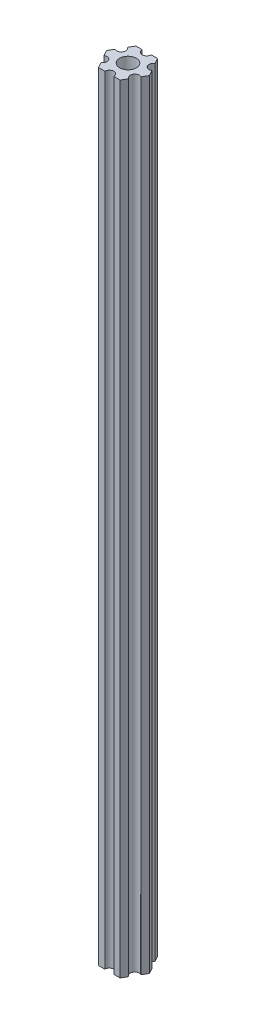
ISO-10303-21;
HEADER;
FILE_DESCRIPTION(('STEP AP214'),'2;1');
FILE_NAME('part.step','',(''),(''),'','','');
FILE_SCHEMA(('AUTOMOTIVE_DESIGN { 1 0 10303 214 1 1 1 1 }'));
ENDSEC;
DATA;
#1=APPLICATION_CONTEXT('core data for automotive mechanical design processes');
#2=APPLICATION_PROTOCOL_DEFINITION('international standard','automotive_design',2000,#1);
#3=PRODUCT_CONTEXT('',#1,'mechanical');
#4=PRODUCT('Part','Part','',(#3));
#5=PRODUCT_RELATED_PRODUCT_CATEGORY('part','',(#4));
#6=PRODUCT_DEFINITION_FORMATION('','',#4);
#7=PRODUCT_DEFINITION_CONTEXT('part definition',#1,'design');
#8=PRODUCT_DEFINITION('design','',#6,#7);
#9=PRODUCT_DEFINITION_SHAPE('','',#8);
#10=(LENGTH_UNIT() NAMED_UNIT(*) SI_UNIT(.MILLI.,.METRE.));
#11=(NAMED_UNIT(*) PLANE_ANGLE_UNIT() SI_UNIT($,.RADIAN.));
#12=(NAMED_UNIT(*) SI_UNIT($,.STERADIAN.) SOLID_ANGLE_UNIT());
#13=UNCERTAINTY_MEASURE_WITH_UNIT(LENGTH_MEASURE(1.E-05),#10,'distance_accuracy_value','');
#14=(GEOMETRIC_REPRESENTATION_CONTEXT(3) GLOBAL_UNCERTAINTY_ASSIGNED_CONTEXT((#13)) GLOBAL_UNIT_ASSIGNED_CONTEXT((#10,
#11,#12)) REPRESENTATION_CONTEXT('',''));
#15=CARTESIAN_POINT('',(0.,0.,0.));
#16=DIRECTION('',(0.,0.,1.));
#17=DIRECTION('',(1.,0.,0.));
#18=AXIS2_PLACEMENT_3D('',#15,#16,#17);
#19=CARTESIAN_POINT('',(5.41265877365274,-175.,3.125));
#20=DIRECTION('',(0.,1.,0.));
#21=DIRECTION('',(0.,0.,1.));
#22=AXIS2_PLACEMENT_3D('',#19,#20,#21);
#23=CYLINDRICAL_SURFACE('',#22,1.5);
#24=CARTESIAN_POINT('',(5.41265877365274,85.,3.125));
#25=DIRECTION('',(0.,-1.,0.));
#26=DIRECTION('',(0.,0.,-1.));
#27=AXIS2_PLACEMENT_3D('',#24,#25,#26);
#28=CIRCLE('',#27,1.5);
#29=CARTESIAN_POINT('',(4.66265877365274,85.,4.42403810567666));
#30=VERTEX_POINT('',#29);
#31=CARTESIAN_POINT('',(6.16265877365274,85.,1.82596189432335));
#32=VERTEX_POINT('',#31);
#33=EDGE_CURVE('E189',#30,#32,#28,.T.);
#34=ORIENTED_EDGE('',*,*,#33,.F.);
#35=DIRECTION('',(0.,1.,0.));
#36=VECTOR('',#35,1.);
#37=CARTESIAN_POINT('',(4.66265877365274,-175.,4.42403810567666));
#38=LINE('',#37,#36);
#39=CARTESIAN_POINT('',(4.66265877365274,-175.,4.42403810567666));
#40=VERTEX_POINT('',#39);
#41=EDGE_CURVE('E11',#40,#30,#38,.T.);
#42=ORIENTED_EDGE('',*,*,#41,.F.);
#43=CARTESIAN_POINT('',(5.41265877365274,-175.,3.125));
#44=DIRECTION('',(0.,-1.,0.));
#45=DIRECTION('',(0.,0.,-1.));
#46=AXIS2_PLACEMENT_3D('',#43,#44,#45);
#47=CIRCLE('',#46,1.5);
#48=CARTESIAN_POINT('',(6.16265877365274,-175.,1.82596189432335));
#49=VERTEX_POINT('',#48);
#50=EDGE_CURVE('E240',#40,#49,#47,.T.);
#51=ORIENTED_EDGE('',*,*,#50,.T.);
#52=DIRECTION('',(0.,1.,0.));
#53=VECTOR('',#52,1.);
#54=CARTESIAN_POINT('',(6.16265877365274,-175.,1.82596189432335));
#55=LINE('',#54,#53);
#56=EDGE_CURVE('E35',#49,#32,#55,.T.);
#57=ORIENTED_EDGE('',*,*,#56,.T.);
#58=EDGE_LOOP('',(#34,#42,#51,#57));
#59=FACE_BOUND('',#58,.T.);
#60=ADVANCED_FACE('F32',(#59),#23,.F.);
#61=CARTESIAN_POINT('',(3.60843918243516,-175.,6.25));
#62=DIRECTION('',(0.866025403784439,0.,0.5));
#63=DIRECTION('',(0.5,0.,-0.866025403784439));
#64=AXIS2_PLACEMENT_3D('',#61,#62,#63);
#65=PLANE('',#64);
#66=DIRECTION('',(0.5,0.,-0.866025403784439));
#67=VECTOR('',#66,1.);
#68=CARTESIAN_POINT('',(3.60843918243516,85.,6.25));
#69=LINE('',#68,#67);
#70=CARTESIAN_POINT('',(3.60843918243516,85.,6.25));
#71=VERTEX_POINT('',#70);
#72=EDGE_CURVE('E238',#71,#30,#69,.T.);
#73=ORIENTED_EDGE('',*,*,#72,.F.);
#74=DIRECTION('',(0.,1.,0.));
#75=VECTOR('',#74,1.);
#76=CARTESIAN_POINT('',(3.60843918243516,-175.,6.25));
#77=LINE('',#76,#75);
#78=CARTESIAN_POINT('',(3.60843918243516,-175.,6.25));
#79=VERTEX_POINT('',#78);
#80=EDGE_CURVE('E41',#79,#71,#77,.T.);
#81=ORIENTED_EDGE('',*,*,#80,.F.);
#82=DIRECTION('',(0.5,0.,-0.866025403784439));
#83=VECTOR('',#82,1.);
#84=CARTESIAN_POINT('',(3.60843918243516,-175.,6.25));
#85=LINE('',#84,#83);
#86=EDGE_CURVE('E179',#79,#40,#85,.T.);
#87=ORIENTED_EDGE('',*,*,#86,.T.);
#88=ORIENTED_EDGE('',*,*,#41,.T.);
#89=EDGE_LOOP('',(#73,#81,#87,#88));
#90=FACE_BOUND('',#89,.T.);
#91=ADVANCED_FACE('F272',(#90),#65,.T.);
#92=CARTESIAN_POINT('',(1.5,-175.,6.25));
#93=DIRECTION('',(0.,0.,1.));
#94=DIRECTION('',(1.,0.,0.));
#95=AXIS2_PLACEMENT_3D('',#92,#93,#94);
#96=PLANE('',#95);
#97=DIRECTION('',(1.,0.,0.));
#98=VECTOR('',#97,1.);
#99=CARTESIAN_POINT('',(1.5,85.,6.25));
#100=LINE('',#99,#98);
#101=CARTESIAN_POINT('',(1.5,85.,6.25));
#102=VERTEX_POINT('',#101);
#103=EDGE_CURVE('E166',#102,#71,#100,.T.);
#104=ORIENTED_EDGE('',*,*,#103,.F.);
#105=DIRECTION('',(0.,1.,0.));
#106=VECTOR('',#105,1.);
#107=CARTESIAN_POINT('',(1.5,-175.,6.25));
#108=LINE('',#107,#106);
#109=CARTESIAN_POINT('',(1.5,-175.,6.25));
#110=VERTEX_POINT('',#109);
#111=EDGE_CURVE('E161',#110,#102,#108,.T.);
#112=ORIENTED_EDGE('',*,*,#111,.F.);
#113=DIRECTION('',(1.,0.,0.));
#114=VECTOR('',#113,1.);
#115=CARTESIAN_POINT('',(1.5,-175.,6.25));
#116=LINE('',#115,#114);
#117=EDGE_CURVE('E164',#110,#79,#116,.T.);
#118=ORIENTED_EDGE('',*,*,#117,.T.);
#119=ORIENTED_EDGE('',*,*,#80,.T.);
#120=EDGE_LOOP('',(#104,#112,#118,#119));
#121=FACE_BOUND('',#120,.T.);
#122=ADVANCED_FACE('F163',(#121),#96,.T.);
#123=CARTESIAN_POINT('',(0.,-175.,6.25));
#124=DIRECTION('',(0.,1.,0.));
#125=DIRECTION('',(0.,0.,1.));
#126=AXIS2_PLACEMENT_3D('',#123,#124,#125);
#127=CYLINDRICAL_SURFACE('',#126,1.5);
#128=CARTESIAN_POINT('',(0.,85.,6.25));
#129=DIRECTION('',(0.,-1.,0.));
#130=DIRECTION('',(0.,0.,-1.));
#131=AXIS2_PLACEMENT_3D('',#128,#129,#130);
#132=CIRCLE('',#131,1.5);
#133=CARTESIAN_POINT('',(-1.5,85.,6.25));
#134=VERTEX_POINT('',#133);
#135=EDGE_CURVE('E235',#134,#102,#132,.T.);
#136=ORIENTED_EDGE('',*,*,#135,.F.);
#137=DIRECTION('',(0.,1.,0.));
#138=VECTOR('',#137,1.);
#139=CARTESIAN_POINT('',(-1.5,-175.,6.25));
#140=LINE('',#139,#138);
#141=CARTESIAN_POINT('',(-1.5,-175.,6.25));
#142=VERTEX_POINT('',#141);
#143=EDGE_CURVE('E171',#142,#134,#140,.T.);
#144=ORIENTED_EDGE('',*,*,#143,.F.);
#145=CARTESIAN_POINT('',(0.,-175.,6.25));
#146=DIRECTION('',(0.,-1.,0.));
#147=DIRECTION('',(0.,0.,-1.));
#148=AXIS2_PLACEMENT_3D('',#145,#146,#147);
#149=CIRCLE('',#148,1.5);
#150=EDGE_CURVE('E177',#142,#110,#149,.T.);
#151=ORIENTED_EDGE('',*,*,#150,.T.);
#152=ORIENTED_EDGE('',*,*,#111,.T.);
#153=EDGE_LOOP('',(#136,#144,#151,#152));
#154=FACE_BOUND('',#153,.T.);
#155=ADVANCED_FACE('F181',(#154),#127,.F.);
#156=CARTESIAN_POINT('',(-3.60843918243516,-175.,6.25));
#157=DIRECTION('',(0.,0.,1.));
#158=DIRECTION('',(1.,0.,0.));
#159=AXIS2_PLACEMENT_3D('',#156,#157,#158);
#160=PLANE('',#159);
#161=DIRECTION('',(1.,0.,0.));
#162=VECTOR('',#161,1.);
#163=CARTESIAN_POINT('',(-3.60843918243516,85.,6.25));
#164=LINE('',#163,#162);
#165=CARTESIAN_POINT('',(-3.60843918243516,85.,6.25));
#166=VERTEX_POINT('',#165);
#167=EDGE_CURVE('E232',#166,#134,#164,.T.);
#168=ORIENTED_EDGE('',*,*,#167,.F.);
#169=DIRECTION('',(0.,1.,0.));
#170=VECTOR('',#169,1.);
#171=CARTESIAN_POINT('',(-3.60843918243516,-175.,6.25));
#172=LINE('',#171,#170);
#173=CARTESIAN_POINT('',(-3.60843918243516,-175.,6.25));
#174=VERTEX_POINT('',#173);
#175=EDGE_CURVE('E244',#174,#166,#172,.T.);
#176=ORIENTED_EDGE('',*,*,#175,.F.);
#177=DIRECTION('',(1.,0.,0.));
#178=VECTOR('',#177,1.);
#179=CARTESIAN_POINT('',(-3.60843918243516,-175.,6.25));
#180=LINE('',#179,#178);
#181=EDGE_CURVE('E182',#174,#142,#180,.T.);
#182=ORIENTED_EDGE('',*,*,#181,.T.);
#183=ORIENTED_EDGE('',*,*,#143,.T.);
#184=EDGE_LOOP('',(#168,#176,#182,#183));
#185=FACE_BOUND('',#184,.T.);
#186=ADVANCED_FACE('F285',(#185),#160,.T.);
#187=CARTESIAN_POINT('',(-4.66265877365274,-175.,4.42403810567666));
#188=DIRECTION('',(-0.866025403784439,0.,0.5));
#189=DIRECTION('',(0.5,0.,0.866025403784439));
#190=AXIS2_PLACEMENT_3D('',#187,#188,#189);
#191=PLANE('',#190);
#192=DIRECTION('',(0.5,0.,0.866025403784439));
#193=VECTOR('',#192,1.);
#194=CARTESIAN_POINT('',(-4.66265877365274,85.,4.42403810567666));
#195=LINE('',#194,#193);
#196=CARTESIAN_POINT('',(-4.66265877365274,85.,4.42403810567666));
#197=VERTEX_POINT('',#196);
#198=EDGE_CURVE('E229',#197,#166,#195,.T.);
#199=ORIENTED_EDGE('',*,*,#198,.F.);
#200=DIRECTION('',(0.,1.,0.));
#201=VECTOR('',#200,1.);
#202=CARTESIAN_POINT('',(-4.66265877365274,-175.,4.42403810567666));
#203=LINE('',#202,#201);
#204=CARTESIAN_POINT('',(-4.66265877365274,-175.,4.42403810567666));
#205=VERTEX_POINT('',#204);
#206=EDGE_CURVE('E246',#205,#197,#203,.T.);
#207=ORIENTED_EDGE('',*,*,#206,.F.);
#208=DIRECTION('',(0.5,0.,0.866025403784439));
#209=VECTOR('',#208,1.);
#210=CARTESIAN_POINT('',(-4.66265877365274,-175.,4.42403810567666));
#211=LINE('',#210,#209);
#212=EDGE_CURVE('E184',#205,#174,#211,.T.);
#213=ORIENTED_EDGE('',*,*,#212,.T.);
#214=ORIENTED_EDGE('',*,*,#175,.T.);
#215=EDGE_LOOP('',(#199,#207,#213,#214));
#216=FACE_BOUND('',#215,.T.);
#217=ADVANCED_FACE('F288',(#216),#191,.T.);
#218=CARTESIAN_POINT('',(-5.41265877365274,-175.,3.125));
#219=DIRECTION('',(0.,1.,0.));
#220=DIRECTION('',(0.,0.,1.));
#221=AXIS2_PLACEMENT_3D('',#218,#219,#220);
#222=CYLINDRICAL_SURFACE('',#221,1.5);
#223=CARTESIAN_POINT('',(-5.41265877365274,85.,3.125));
#224=DIRECTION('',(0.,-1.,0.));
#225=DIRECTION('',(0.,0.,-1.));
#226=AXIS2_PLACEMENT_3D('',#223,#224,#225);
#227=CIRCLE('',#226,1.5);
#228=CARTESIAN_POINT('',(-6.16265877365274,85.,1.82596189432335));
#229=VERTEX_POINT('',#228);
#230=EDGE_CURVE('E226',#229,#197,#227,.T.);
#231=ORIENTED_EDGE('',*,*,#230,.F.);
#232=DIRECTION('',(0.,1.,0.));
#233=VECTOR('',#232,1.);
#234=CARTESIAN_POINT('',(-6.16265877365274,-175.,1.82596189432335));
#235=LINE('',#234,#233);
#236=CARTESIAN_POINT('',(-6.16265877365274,-175.,1.82596189432335));
#237=VERTEX_POINT('',#236);
#238=EDGE_CURVE('E248',#237,#229,#235,.T.);
#239=ORIENTED_EDGE('',*,*,#238,.F.);
#240=CARTESIAN_POINT('',(-5.41265877365274,-175.,3.125));
#241=DIRECTION('',(0.,-1.,0.));
#242=DIRECTION('',(0.,0.,-1.));
#243=AXIS2_PLACEMENT_3D('',#240,#241,#242);
#244=CIRCLE('',#243,1.5);
#245=EDGE_CURVE('E393',#237,#205,#244,.T.);
#246=ORIENTED_EDGE('',*,*,#245,.T.);
#247=ORIENTED_EDGE('',*,*,#206,.T.);
#248=EDGE_LOOP('',(#231,#239,#246,#247));
#249=FACE_BOUND('',#248,.T.);
#250=ADVANCED_FACE('F292',(#249),#222,.F.);
#251=CARTESIAN_POINT('',(-7.21687836487032,-175.,0.));
#252=DIRECTION('',(-0.866025403784439,0.,0.499999999999998));
#253=DIRECTION('',(0.499999999999998,0.,0.86602540378444));
#254=AXIS2_PLACEMENT_3D('',#251,#252,#253);
#255=PLANE('',#254);
#256=DIRECTION('',(0.499999999999998,0.,0.86602540378444));
#257=VECTOR('',#256,1.);
#258=CARTESIAN_POINT('',(-7.21687836487032,85.,0.));
#259=LINE('',#258,#257);
#260=CARTESIAN_POINT('',(-7.21687836487032,85.,0.));
#261=VERTEX_POINT('',#260);
#262=EDGE_CURVE('E223',#261,#229,#259,.T.);
#263=ORIENTED_EDGE('',*,*,#262,.F.);
#264=DIRECTION('',(0.,1.,0.));
#265=VECTOR('',#264,1.);
#266=CARTESIAN_POINT('',(-7.21687836487032,-175.,0.));
#267=LINE('',#266,#265);
#268=CARTESIAN_POINT('',(-7.21687836487032,-175.,0.));
#269=VERTEX_POINT('',#268);
#270=EDGE_CURVE('E250',#269,#261,#267,.T.);
#271=ORIENTED_EDGE('',*,*,#270,.F.);
#272=DIRECTION('',(0.499999999999998,0.,0.86602540378444));
#273=VECTOR('',#272,1.);
#274=CARTESIAN_POINT('',(-7.21687836487032,-175.,0.));
#275=LINE('',#274,#273);
#276=EDGE_CURVE('E390',#269,#237,#275,.T.);
#277=ORIENTED_EDGE('',*,*,#276,.T.);
#278=ORIENTED_EDGE('',*,*,#238,.T.);
#279=EDGE_LOOP('',(#263,#271,#277,#278));
#280=FACE_BOUND('',#279,.T.);
#281=ADVANCED_FACE('F296',(#280),#255,.T.);
#282=CARTESIAN_POINT('',(-6.16265877365274,-175.,-1.82596189432334));
#283=DIRECTION('',(-0.866025403784438,0.,-0.5));
#284=DIRECTION('',(-0.5,0.,0.866025403784438));
#285=AXIS2_PLACEMENT_3D('',#282,#283,#284);
#286=PLANE('',#285);
#287=DIRECTION('',(-0.5,0.,0.866025403784438));
#288=VECTOR('',#287,1.);
#289=CARTESIAN_POINT('',(-6.16265877365274,85.,-1.82596189432334));
#290=LINE('',#289,#288);
#291=CARTESIAN_POINT('',(-6.16265877365274,85.,-1.82596189432334));
#292=VERTEX_POINT('',#291);
#293=EDGE_CURVE('E220',#292,#261,#290,.T.);
#294=ORIENTED_EDGE('',*,*,#293,.F.);
#295=DIRECTION('',(0.,1.,0.));
#296=VECTOR('',#295,1.);
#297=CARTESIAN_POINT('',(-6.16265877365274,-175.,-1.82596189432334));
#298=LINE('',#297,#296);
#299=CARTESIAN_POINT('',(-6.16265877365274,-175.,-1.82596189432334));
#300=VERTEX_POINT('',#299);
#301=EDGE_CURVE('E252',#300,#292,#298,.T.);
#302=ORIENTED_EDGE('',*,*,#301,.F.);
#303=DIRECTION('',(-0.5,0.,0.866025403784438));
#304=VECTOR('',#303,1.);
#305=CARTESIAN_POINT('',(-6.16265877365274,-175.,-1.82596189432334));
#306=LINE('',#305,#304);
#307=EDGE_CURVE('E387',#300,#269,#306,.T.);
#308=ORIENTED_EDGE('',*,*,#307,.T.);
#309=ORIENTED_EDGE('',*,*,#270,.T.);
#310=EDGE_LOOP('',(#294,#302,#308,#309));
#311=FACE_BOUND('',#310,.T.);
#312=ADVANCED_FACE('F300',(#311),#286,.T.);
#313=CARTESIAN_POINT('',(-5.41265877365274,-175.,-3.125));
#314=DIRECTION('',(0.,1.,0.));
#315=DIRECTION('',(0.,0.,1.));
#316=AXIS2_PLACEMENT_3D('',#313,#314,#315);
#317=CYLINDRICAL_SURFACE('',#316,1.5);
#318=CARTESIAN_POINT('',(-5.41265877365274,85.,-3.125));
#319=DIRECTION('',(0.,-1.,0.));
#320=DIRECTION('',(0.,0.,-1.));
#321=AXIS2_PLACEMENT_3D('',#318,#319,#320);
#322=CIRCLE('',#321,1.5);
#323=CARTESIAN_POINT('',(-4.66265877365274,85.,-4.42403810567666));
#324=VERTEX_POINT('',#323);
#325=EDGE_CURVE('E217',#324,#292,#322,.T.);
#326=ORIENTED_EDGE('',*,*,#325,.F.);
#327=DIRECTION('',(0.,1.,0.));
#328=VECTOR('',#327,1.);
#329=CARTESIAN_POINT('',(-4.66265877365274,-175.,-4.42403810567666));
#330=LINE('',#329,#328);
#331=CARTESIAN_POINT('',(-4.66265877365274,-175.,-4.42403810567666));
#332=VERTEX_POINT('',#331);
#333=EDGE_CURVE('E254',#332,#324,#330,.T.);
#334=ORIENTED_EDGE('',*,*,#333,.F.);
#335=CARTESIAN_POINT('',(-5.41265877365274,-175.,-3.125));
#336=DIRECTION('',(0.,-1.,0.));
#337=DIRECTION('',(0.,0.,-1.));
#338=AXIS2_PLACEMENT_3D('',#335,#336,#337);
#339=CIRCLE('',#338,1.5);
#340=EDGE_CURVE('E384',#332,#300,#339,.T.);
#341=ORIENTED_EDGE('',*,*,#340,.T.);
#342=ORIENTED_EDGE('',*,*,#301,.T.);
#343=EDGE_LOOP('',(#326,#334,#341,#342));
#344=FACE_BOUND('',#343,.T.);
#345=ADVANCED_FACE('F304',(#344),#317,.F.);
#346=CARTESIAN_POINT('',(-3.60843918243516,-175.,-6.25));
#347=DIRECTION('',(-0.866025403784439,0.,-0.5));
#348=DIRECTION('',(-0.5,0.,0.866025403784439));
#349=AXIS2_PLACEMENT_3D('',#346,#347,#348);
#350=PLANE('',#349);
#351=DIRECTION('',(-0.5,0.,0.866025403784439));
#352=VECTOR('',#351,1.);
#353=CARTESIAN_POINT('',(-3.60843918243516,85.,-6.25));
#354=LINE('',#353,#352);
#355=CARTESIAN_POINT('',(-3.60843918243516,85.,-6.25));
#356=VERTEX_POINT('',#355);
#357=EDGE_CURVE('E214',#356,#324,#354,.T.);
#358=ORIENTED_EDGE('',*,*,#357,.F.);
#359=DIRECTION('',(0.,1.,0.));
#360=VECTOR('',#359,1.);
#361=CARTESIAN_POINT('',(-3.60843918243516,-175.,-6.25));
#362=LINE('',#361,#360);
#363=CARTESIAN_POINT('',(-3.60843918243516,-175.,-6.25));
#364=VERTEX_POINT('',#363);
#365=EDGE_CURVE('E256',#364,#356,#362,.T.);
#366=ORIENTED_EDGE('',*,*,#365,.F.);
#367=DIRECTION('',(-0.5,0.,0.866025403784439));
#368=VECTOR('',#367,1.);
#369=CARTESIAN_POINT('',(-3.60843918243516,-175.,-6.25));
#370=LINE('',#369,#368);
#371=EDGE_CURVE('E381',#364,#332,#370,.T.);
#372=ORIENTED_EDGE('',*,*,#371,.T.);
#373=ORIENTED_EDGE('',*,*,#333,.T.);
#374=EDGE_LOOP('',(#358,#366,#372,#373));
#375=FACE_BOUND('',#374,.T.);
#376=ADVANCED_FACE('F308',(#375),#350,.T.);
#377=CARTESIAN_POINT('',(-1.5,-175.,-6.25));
#378=DIRECTION('',(0.,0.,-1.));
#379=DIRECTION('',(-1.,0.,0.));
#380=AXIS2_PLACEMENT_3D('',#377,#378,#379);
#381=PLANE('',#380);
#382=DIRECTION('',(-1.,0.,0.));
#383=VECTOR('',#382,1.);
#384=CARTESIAN_POINT('',(-1.5,85.,-6.25));
#385=LINE('',#384,#383);
#386=CARTESIAN_POINT('',(-1.5,85.,-6.25));
#387=VERTEX_POINT('',#386);
#388=EDGE_CURVE('E211',#387,#356,#385,.T.);
#389=ORIENTED_EDGE('',*,*,#388,.F.);
#390=DIRECTION('',(0.,1.,0.));
#391=VECTOR('',#390,1.);
#392=CARTESIAN_POINT('',(-1.5,-175.,-6.25));
#393=LINE('',#392,#391);
#394=CARTESIAN_POINT('',(-1.5,-175.,-6.25));
#395=VERTEX_POINT('',#394);
#396=EDGE_CURVE('E258',#395,#387,#393,.T.);
#397=ORIENTED_EDGE('',*,*,#396,.F.);
#398=DIRECTION('',(-1.,0.,0.));
#399=VECTOR('',#398,1.);
#400=CARTESIAN_POINT('',(-1.5,-175.,-6.25));
#401=LINE('',#400,#399);
#402=EDGE_CURVE('E378',#395,#364,#401,.T.);
#403=ORIENTED_EDGE('',*,*,#402,.T.);
#404=ORIENTED_EDGE('',*,*,#365,.T.);
#405=EDGE_LOOP('',(#389,#397,#403,#404));
#406=FACE_BOUND('',#405,.T.);
#407=ADVANCED_FACE('F312',(#406),#381,.T.);
#408=CARTESIAN_POINT('',(0.,-175.,-6.25));
#409=DIRECTION('',(0.,1.,0.));
#410=DIRECTION('',(0.,0.,1.));
#411=AXIS2_PLACEMENT_3D('',#408,#409,#410);
#412=CYLINDRICAL_SURFACE('',#411,1.5);
#413=CARTESIAN_POINT('',(0.,85.,-6.25));
#414=DIRECTION('',(0.,-1.,0.));
#415=DIRECTION('',(0.,0.,-1.));
#416=AXIS2_PLACEMENT_3D('',#413,#414,#415);
#417=CIRCLE('',#416,1.5);
#418=CARTESIAN_POINT('',(1.5,85.,-6.25));
#419=VERTEX_POINT('',#418);
#420=EDGE_CURVE('E208',#419,#387,#417,.T.);
#421=ORIENTED_EDGE('',*,*,#420,.F.);
#422=DIRECTION('',(0.,1.,0.));
#423=VECTOR('',#422,1.);
#424=CARTESIAN_POINT('',(1.5,-175.,-6.25));
#425=LINE('',#424,#423);
#426=CARTESIAN_POINT('',(1.5,-175.,-6.25));
#427=VERTEX_POINT('',#426);
#428=EDGE_CURVE('E260',#427,#419,#425,.T.);
#429=ORIENTED_EDGE('',*,*,#428,.F.);
#430=CARTESIAN_POINT('',(0.,-175.,-6.25));
#431=DIRECTION('',(0.,-1.,0.));
#432=DIRECTION('',(0.,0.,-1.));
#433=AXIS2_PLACEMENT_3D('',#430,#431,#432);
#434=CIRCLE('',#433,1.5);
#435=EDGE_CURVE('E375',#427,#395,#434,.T.);
#436=ORIENTED_EDGE('',*,*,#435,.T.);
#437=ORIENTED_EDGE('',*,*,#396,.T.);
#438=EDGE_LOOP('',(#421,#429,#436,#437));
#439=FACE_BOUND('',#438,.T.);
#440=ADVANCED_FACE('F316',(#439),#412,.F.);
#441=CARTESIAN_POINT('',(3.60843918243516,-175.,-6.25));
#442=DIRECTION('',(0.,0.,-1.));
#443=DIRECTION('',(-1.,0.,0.));
#444=AXIS2_PLACEMENT_3D('',#441,#442,#443);
#445=PLANE('',#444);
#446=DIRECTION('',(-1.,0.,0.));
#447=VECTOR('',#446,1.);
#448=CARTESIAN_POINT('',(3.60843918243516,85.,-6.25));
#449=LINE('',#448,#447);
#450=CARTESIAN_POINT('',(3.60843918243516,85.,-6.25));
#451=VERTEX_POINT('',#450);
#452=EDGE_CURVE('E205',#451,#419,#449,.T.);
#453=ORIENTED_EDGE('',*,*,#452,.F.);
#454=DIRECTION('',(0.,1.,0.));
#455=VECTOR('',#454,1.);
#456=CARTESIAN_POINT('',(3.60843918243516,-175.,-6.25));
#457=LINE('',#456,#455);
#458=CARTESIAN_POINT('',(3.60843918243516,-175.,-6.25));
#459=VERTEX_POINT('',#458);
#460=EDGE_CURVE('E262',#459,#451,#457,.T.);
#461=ORIENTED_EDGE('',*,*,#460,.F.);
#462=DIRECTION('',(-1.,0.,0.));
#463=VECTOR('',#462,1.);
#464=CARTESIAN_POINT('',(3.60843918243516,-175.,-6.25));
#465=LINE('',#464,#463);
#466=EDGE_CURVE('E372',#459,#427,#465,.T.);
#467=ORIENTED_EDGE('',*,*,#466,.T.);
#468=ORIENTED_EDGE('',*,*,#428,.T.);
#469=EDGE_LOOP('',(#453,#461,#467,#468));
#470=FACE_BOUND('',#469,.T.);
#471=ADVANCED_FACE('F320',(#470),#445,.T.);
#472=CARTESIAN_POINT('',(4.66265877365274,-175.,-4.42403810567666));
#473=DIRECTION('',(0.866025403784439,0.,-0.5));
#474=DIRECTION('',(-0.5,0.,-0.866025403784439));
#475=AXIS2_PLACEMENT_3D('',#472,#473,#474);
#476=PLANE('',#475);
#477=DIRECTION('',(-0.5,0.,-0.866025403784439));
#478=VECTOR('',#477,1.);
#479=CARTESIAN_POINT('',(4.66265877365274,85.,-4.42403810567666));
#480=LINE('',#479,#478);
#481=CARTESIAN_POINT('',(4.66265877365274,85.,-4.42403810567666));
#482=VERTEX_POINT('',#481);
#483=EDGE_CURVE('E202',#482,#451,#480,.T.);
#484=ORIENTED_EDGE('',*,*,#483,.F.);
#485=DIRECTION('',(0.,1.,0.));
#486=VECTOR('',#485,1.);
#487=CARTESIAN_POINT('',(4.66265877365274,-175.,-4.42403810567666));
#488=LINE('',#487,#486);
#489=CARTESIAN_POINT('',(4.66265877365274,-175.,-4.42403810567666));
#490=VERTEX_POINT('',#489);
#491=EDGE_CURVE('E264',#490,#482,#488,.T.);
#492=ORIENTED_EDGE('',*,*,#491,.F.);
#493=DIRECTION('',(-0.5,0.,-0.866025403784439));
#494=VECTOR('',#493,1.);
#495=CARTESIAN_POINT('',(4.66265877365274,-175.,-4.42403810567666));
#496=LINE('',#495,#494);
#497=EDGE_CURVE('E369',#490,#459,#496,.T.);
#498=ORIENTED_EDGE('',*,*,#497,.T.);
#499=ORIENTED_EDGE('',*,*,#460,.T.);
#500=EDGE_LOOP('',(#484,#492,#498,#499));
#501=FACE_BOUND('',#500,.T.);
#502=ADVANCED_FACE('F324',(#501),#476,.T.);
#503=CARTESIAN_POINT('',(5.41265877365274,-175.,-3.125));
#504=DIRECTION('',(0.,1.,0.));
#505=DIRECTION('',(0.,0.,1.));
#506=AXIS2_PLACEMENT_3D('',#503,#504,#505);
#507=CYLINDRICAL_SURFACE('',#506,1.5);
#508=CARTESIAN_POINT('',(5.41265877365274,85.,-3.125));
#509=DIRECTION('',(0.,-1.,0.));
#510=DIRECTION('',(0.,0.,-1.));
#511=AXIS2_PLACEMENT_3D('',#508,#509,#510);
#512=CIRCLE('',#511,1.5);
#513=CARTESIAN_POINT('',(6.16265877365274,85.,-1.82596189432334));
#514=VERTEX_POINT('',#513);
#515=EDGE_CURVE('E199',#514,#482,#512,.T.);
#516=ORIENTED_EDGE('',*,*,#515,.F.);
#517=DIRECTION('',(0.,1.,0.));
#518=VECTOR('',#517,1.);
#519=CARTESIAN_POINT('',(6.16265877365274,-175.,-1.82596189432334));
#520=LINE('',#519,#518);
#521=CARTESIAN_POINT('',(6.16265877365274,-175.,-1.82596189432334));
#522=VERTEX_POINT('',#521);
#523=EDGE_CURVE('E266',#522,#514,#520,.T.);
#524=ORIENTED_EDGE('',*,*,#523,.F.);
#525=CARTESIAN_POINT('',(5.41265877365274,-175.,-3.125));
#526=DIRECTION('',(0.,-1.,0.));
#527=DIRECTION('',(0.,0.,-1.));
#528=AXIS2_PLACEMENT_3D('',#525,#526,#527);
#529=CIRCLE('',#528,1.5);
#530=EDGE_CURVE('E366',#522,#490,#529,.T.);
#531=ORIENTED_EDGE('',*,*,#530,.T.);
#532=ORIENTED_EDGE('',*,*,#491,.T.);
#533=EDGE_LOOP('',(#516,#524,#531,#532));
#534=FACE_BOUND('',#533,.T.);
#535=ADVANCED_FACE('F328',(#534),#507,.F.);
#536=CARTESIAN_POINT('',(7.21687836487032,-175.,0.));
#537=DIRECTION('',(0.866025403784438,0.,-0.5));
#538=DIRECTION('',(-0.5,0.,-0.866025403784439));
#539=AXIS2_PLACEMENT_3D('',#536,#537,#538);
#540=PLANE('',#539);
#541=DIRECTION('',(-0.5,0.,-0.866025403784439));
#542=VECTOR('',#541,1.);
#543=CARTESIAN_POINT('',(7.21687836487032,85.,0.));
#544=LINE('',#543,#542);
#545=CARTESIAN_POINT('',(7.21687836487032,85.,0.));
#546=VERTEX_POINT('',#545);
#547=EDGE_CURVE('E196',#546,#514,#544,.T.);
#548=ORIENTED_EDGE('',*,*,#547,.F.);
#549=DIRECTION('',(0.,1.,0.));
#550=VECTOR('',#549,1.);
#551=CARTESIAN_POINT('',(7.21687836487032,-175.,0.));
#552=LINE('',#551,#550);
#553=CARTESIAN_POINT('',(7.21687836487032,-175.,0.));
#554=VERTEX_POINT('',#553);
#555=EDGE_CURVE('E267',#554,#546,#552,.T.);
#556=ORIENTED_EDGE('',*,*,#555,.F.);
#557=DIRECTION('',(-0.5,0.,-0.866025403784439));
#558=VECTOR('',#557,1.);
#559=CARTESIAN_POINT('',(7.21687836487032,-175.,0.));
#560=LINE('',#559,#558);
#561=EDGE_CURVE('E363',#554,#522,#560,.T.);
#562=ORIENTED_EDGE('',*,*,#561,.T.);
#563=ORIENTED_EDGE('',*,*,#523,.T.);
#564=EDGE_LOOP('',(#548,#556,#562,#563));
#565=FACE_BOUND('',#564,.T.);
#566=ADVANCED_FACE('F332',(#565),#540,.T.);
#567=CARTESIAN_POINT('',(6.16265877365274,-175.,1.82596189432335));
#568=DIRECTION('',(0.866025403784439,0.,0.499999999999999));
#569=DIRECTION('',(0.499999999999999,0.,-0.866025403784439));
#570=AXIS2_PLACEMENT_3D('',#567,#568,#569);
#571=PLANE('',#570);
#572=DIRECTION('',(0.499999999999999,0.,-0.86602540378444));
#573=VECTOR('',#572,1.);
#574=CARTESIAN_POINT('',(6.16265877365274,85.,1.82596189432335));
#575=LINE('',#574,#573);
#576=EDGE_CURVE('E192',#32,#546,#575,.T.);
#577=ORIENTED_EDGE('',*,*,#576,.F.);
#578=ORIENTED_EDGE('',*,*,#56,.F.);
#579=DIRECTION('',(0.499999999999999,0.,-0.86602540378444));
#580=VECTOR('',#579,1.);
#581=CARTESIAN_POINT('',(6.16265877365274,-175.,1.82596189432335));
#582=LINE('',#581,#580);
#583=EDGE_CURVE('E361',#49,#554,#582,.T.);
#584=ORIENTED_EDGE('',*,*,#583,.T.);
#585=ORIENTED_EDGE('',*,*,#555,.T.);
#586=EDGE_LOOP('',(#577,#578,#584,#585));
#587=FACE_BOUND('',#586,.T.);
#588=ADVANCED_FACE('F269',(#587),#571,.T.);
#589=CARTESIAN_POINT('',(5.41265877365274,-175.,3.125));
#590=DIRECTION('',(0.,-1.,0.));
#591=DIRECTION('',(0.,0.,-1.));
#592=AXIS2_PLACEMENT_3D('',#589,#590,#591);
#593=PLANE('',#592);
#594=CARTESIAN_POINT('',(0.,-175.,0.));
#595=DIRECTION('',(0.,1.,0.));
#596=DIRECTION('',(0.,0.,-1.));
#597=AXIS2_PLACEMENT_3D('',#594,#595,#596);
#598=CIRCLE('',#597,2.79);
#599=CARTESIAN_POINT('',(0.,-175.,-2.79));
#600=VERTEX_POINT('',#599);
#601=EDGE_CURVE('E193',#600,#600,#598,.T.);
#602=ORIENTED_EDGE('',*,*,#601,.T.);
#603=EDGE_LOOP('',(#602));
#604=FACE_BOUND('',#603,.T.);
#605=ORIENTED_EDGE('',*,*,#50,.F.);
#606=ORIENTED_EDGE('',*,*,#86,.F.);
#607=ORIENTED_EDGE('',*,*,#117,.F.);
#608=ORIENTED_EDGE('',*,*,#150,.F.);
#609=ORIENTED_EDGE('',*,*,#181,.F.);
#610=ORIENTED_EDGE('',*,*,#212,.F.);
#611=ORIENTED_EDGE('',*,*,#245,.F.);
#612=ORIENTED_EDGE('',*,*,#276,.F.);
#613=ORIENTED_EDGE('',*,*,#307,.F.);
#614=ORIENTED_EDGE('',*,*,#340,.F.);
#615=ORIENTED_EDGE('',*,*,#371,.F.);
#616=ORIENTED_EDGE('',*,*,#402,.F.);
#617=ORIENTED_EDGE('',*,*,#435,.F.);
#618=ORIENTED_EDGE('',*,*,#466,.F.);
#619=ORIENTED_EDGE('',*,*,#497,.F.);
#620=ORIENTED_EDGE('',*,*,#530,.F.);
#621=ORIENTED_EDGE('',*,*,#561,.F.);
#622=ORIENTED_EDGE('',*,*,#583,.F.);
#623=EDGE_LOOP('',(#605,#606,#607,#608,#609,#610,#611,#612,#613,#614,#615,#616,#617,#618,#619,
#620,#621,#622));
#624=FACE_BOUND('',#623,.T.);
#625=ADVANCED_FACE('F175',(#604,#624),#593,.T.);
#626=CARTESIAN_POINT('',(5.41265877365274,85.,3.125));
#627=DIRECTION('',(0.,-1.,0.));
#628=DIRECTION('',(0.,0.,-1.));
#629=AXIS2_PLACEMENT_3D('',#626,#627,#628);
#630=PLANE('',#629);
#631=CARTESIAN_POINT('',(0.,85.,0.));
#632=DIRECTION('',(0.,1.,0.));
#633=DIRECTION('',(0.,0.,-1.));
#634=AXIS2_PLACEMENT_3D('',#631,#632,#633);
#635=CIRCLE('',#634,2.79);
#636=CARTESIAN_POINT('',(0.,85.,-2.79));
#637=VERTEX_POINT('',#636);
#638=EDGE_CURVE('E356',#637,#637,#635,.T.);
#639=ORIENTED_EDGE('',*,*,#638,.F.);
#640=EDGE_LOOP('',(#639));
#641=FACE_BOUND('',#640,.T.);
#642=ORIENTED_EDGE('',*,*,#33,.T.);
#643=ORIENTED_EDGE('',*,*,#576,.T.);
#644=ORIENTED_EDGE('',*,*,#547,.T.);
#645=ORIENTED_EDGE('',*,*,#515,.T.);
#646=ORIENTED_EDGE('',*,*,#483,.T.);
#647=ORIENTED_EDGE('',*,*,#452,.T.);
#648=ORIENTED_EDGE('',*,*,#420,.T.);
#649=ORIENTED_EDGE('',*,*,#388,.T.);
#650=ORIENTED_EDGE('',*,*,#357,.T.);
#651=ORIENTED_EDGE('',*,*,#325,.T.);
#652=ORIENTED_EDGE('',*,*,#293,.T.);
#653=ORIENTED_EDGE('',*,*,#262,.T.);
#654=ORIENTED_EDGE('',*,*,#230,.T.);
#655=ORIENTED_EDGE('',*,*,#198,.T.);
#656=ORIENTED_EDGE('',*,*,#167,.T.);
#657=ORIENTED_EDGE('',*,*,#135,.T.);
#658=ORIENTED_EDGE('',*,*,#103,.T.);
#659=ORIENTED_EDGE('',*,*,#72,.T.);
#660=EDGE_LOOP('',(#642,#643,#644,#645,#646,#647,#648,#649,#650,#651,#652,#653,#654,#655,#656,
#657,#658,#659));
#661=FACE_BOUND('',#660,.T.);
#662=ADVANCED_FACE('F271',(#641,#661),#630,.F.);
#663=CARTESIAN_POINT('',(0.,-175.,0.));
#664=DIRECTION('',(0.,1.,0.));
#665=DIRECTION('',(0.,0.,1.));
#666=AXIS2_PLACEMENT_3D('',#663,#664,#665);
#667=CYLINDRICAL_SURFACE('',#666,2.79);
#668=ORIENTED_EDGE('',*,*,#601,.F.);
#669=EDGE_LOOP('',(#668));
#670=FACE_BOUND('',#669,.T.);
#671=ORIENTED_EDGE('',*,*,#638,.T.);
#672=EDGE_LOOP('',(#671));
#673=FACE_BOUND('',#672,.T.);
#674=ADVANCED_FACE('F344',(#670,#673),#667,.F.);
#675=CLOSED_SHELL('',(#60,#91,#122,#155,#186,#217,#250,#281,#312,#345,#376,#407,#440,#471,#502,
#535,#566,#588,#625,#662,#674));
#676=MANIFOLD_SOLID_BREP('B2',#675);
#677=ADVANCED_BREP_SHAPE_REPRESENTATION('',(#18,#676),#14);
#678=SHAPE_DEFINITION_REPRESENTATION(#9,#677);
ENDSEC;
END-ISO-10303-21;
